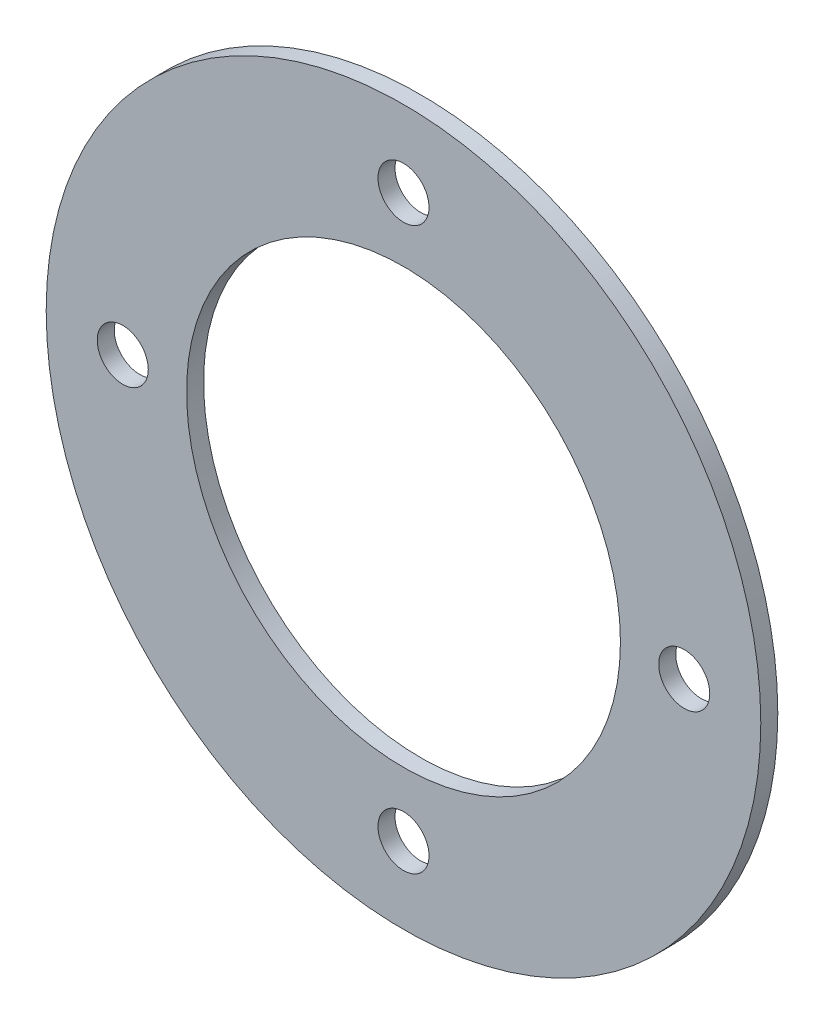
ISO-10303-21;
HEADER;
FILE_DESCRIPTION(('STEP AP214'),'2;1');
FILE_NAME('part.step','',(''),(''),'','','');
FILE_SCHEMA(('AUTOMOTIVE_DESIGN { 1 0 10303 214 1 1 1 1 }'));
ENDSEC;
DATA;
#1=APPLICATION_CONTEXT('core data for automotive mechanical design processes');
#2=APPLICATION_PROTOCOL_DEFINITION('international standard','automotive_design',2000,#1);
#3=PRODUCT_CONTEXT('',#1,'mechanical');
#4=PRODUCT('Part','Part','',(#3));
#5=PRODUCT_RELATED_PRODUCT_CATEGORY('part','',(#4));
#6=PRODUCT_DEFINITION_FORMATION('','',#4);
#7=PRODUCT_DEFINITION_CONTEXT('part definition',#1,'design');
#8=PRODUCT_DEFINITION('design','',#6,#7);
#9=PRODUCT_DEFINITION_SHAPE('','',#8);
#10=(LENGTH_UNIT() NAMED_UNIT(*) SI_UNIT(.MILLI.,.METRE.));
#11=(NAMED_UNIT(*) PLANE_ANGLE_UNIT() SI_UNIT($,.RADIAN.));
#12=(NAMED_UNIT(*) SI_UNIT($,.STERADIAN.) SOLID_ANGLE_UNIT());
#13=UNCERTAINTY_MEASURE_WITH_UNIT(LENGTH_MEASURE(1.E-05),#10,'distance_accuracy_value','');
#14=(GEOMETRIC_REPRESENTATION_CONTEXT(3) GLOBAL_UNCERTAINTY_ASSIGNED_CONTEXT((#13)) GLOBAL_UNIT_ASSIGNED_CONTEXT((#10,
#11,#12)) REPRESENTATION_CONTEXT('',''));
#15=CARTESIAN_POINT('',(0.,0.,0.));
#16=DIRECTION('',(0.,0.,1.));
#17=DIRECTION('',(1.,0.,0.));
#18=AXIS2_PLACEMENT_3D('',#15,#16,#17);
#19=CARTESIAN_POINT('',(0.,0.,1.));
#20=DIRECTION('',(0.,0.,-1.));
#21=DIRECTION('',(-1.,0.,0.));
#22=AXIS2_PLACEMENT_3D('',#19,#20,#21);
#23=CYLINDRICAL_SURFACE('',#22,12.75);
#24=CARTESIAN_POINT('',(0.,0.,1.));
#25=DIRECTION('',(0.,0.,1.));
#26=DIRECTION('',(1.,0.,0.));
#27=AXIS2_PLACEMENT_3D('',#24,#25,#26);
#28=CIRCLE('',#27,12.75);
#29=CARTESIAN_POINT('',(12.75,0.,1.));
#30=VERTEX_POINT('',#29);
#31=EDGE_CURVE('E24',#30,#30,#28,.T.);
#32=ORIENTED_EDGE('',*,*,#31,.T.);
#33=EDGE_LOOP('',(#32));
#34=FACE_BOUND('',#33,.T.);
#35=CARTESIAN_POINT('',(0.,0.,0.));
#36=DIRECTION('',(0.,0.,1.));
#37=DIRECTION('',(1.,0.,0.));
#38=AXIS2_PLACEMENT_3D('',#35,#36,#37);
#39=CIRCLE('',#38,12.75);
#40=CARTESIAN_POINT('',(12.75,0.,0.));
#41=VERTEX_POINT('',#40);
#42=EDGE_CURVE('E53',#41,#41,#39,.T.);
#43=ORIENTED_EDGE('',*,*,#42,.F.);
#44=EDGE_LOOP('',(#43));
#45=FACE_BOUND('',#44,.T.);
#46=ADVANCED_FACE('F15',(#34,#45),#23,.F.);
#47=CARTESIAN_POINT('',(0.,-16.5,1.));
#48=DIRECTION('',(0.,0.,-1.));
#49=DIRECTION('',(-1.,0.,0.));
#50=AXIS2_PLACEMENT_3D('',#47,#48,#49);
#51=CYLINDRICAL_SURFACE('',#50,1.5);
#52=CARTESIAN_POINT('',(0.,-16.5,1.));
#53=DIRECTION('',(0.,0.,1.));
#54=DIRECTION('',(1.,0.,0.));
#55=AXIS2_PLACEMENT_3D('',#52,#53,#54);
#56=CIRCLE('',#55,1.5);
#57=CARTESIAN_POINT('',(1.5,-16.5,1.));
#58=VERTEX_POINT('',#57);
#59=EDGE_CURVE('E34',#58,#58,#56,.T.);
#60=ORIENTED_EDGE('',*,*,#59,.T.);
#61=EDGE_LOOP('',(#60));
#62=FACE_BOUND('',#61,.T.);
#63=CARTESIAN_POINT('',(0.,-16.5,0.));
#64=DIRECTION('',(0.,0.,1.));
#65=DIRECTION('',(1.,0.,0.));
#66=AXIS2_PLACEMENT_3D('',#63,#64,#65);
#67=CIRCLE('',#66,1.5);
#68=CARTESIAN_POINT('',(1.5,-16.5,0.));
#69=VERTEX_POINT('',#68);
#70=EDGE_CURVE('E50',#69,#69,#67,.T.);
#71=ORIENTED_EDGE('',*,*,#70,.F.);
#72=EDGE_LOOP('',(#71));
#73=FACE_BOUND('',#72,.T.);
#74=ADVANCED_FACE('F82',(#62,#73),#51,.F.);
#75=CARTESIAN_POINT('',(0.,16.5,1.));
#76=DIRECTION('',(0.,0.,-1.));
#77=DIRECTION('',(-1.,0.,0.));
#78=AXIS2_PLACEMENT_3D('',#75,#76,#77);
#79=CYLINDRICAL_SURFACE('',#78,1.5);
#80=CARTESIAN_POINT('',(0.,16.5,1.));
#81=DIRECTION('',(0.,0.,1.));
#82=DIRECTION('',(1.,0.,0.));
#83=AXIS2_PLACEMENT_3D('',#80,#81,#82);
#84=CIRCLE('',#83,1.5);
#85=CARTESIAN_POINT('',(1.5,16.5,1.));
#86=VERTEX_POINT('',#85);
#87=EDGE_CURVE('E73',#86,#86,#84,.T.);
#88=ORIENTED_EDGE('',*,*,#87,.T.);
#89=EDGE_LOOP('',(#88));
#90=FACE_BOUND('',#89,.T.);
#91=CARTESIAN_POINT('',(0.,16.5,0.));
#92=DIRECTION('',(0.,0.,1.));
#93=DIRECTION('',(1.,0.,0.));
#94=AXIS2_PLACEMENT_3D('',#91,#92,#93);
#95=CIRCLE('',#94,1.5);
#96=CARTESIAN_POINT('',(1.5,16.5,0.));
#97=VERTEX_POINT('',#96);
#98=EDGE_CURVE('E46',#97,#97,#95,.T.);
#99=ORIENTED_EDGE('',*,*,#98,.F.);
#100=EDGE_LOOP('',(#99));
#101=FACE_BOUND('',#100,.T.);
#102=ADVANCED_FACE('F102',(#90,#101),#79,.F.);
#103=CARTESIAN_POINT('',(16.5,0.,1.));
#104=DIRECTION('',(0.,0.,-1.));
#105=DIRECTION('',(-1.,0.,0.));
#106=AXIS2_PLACEMENT_3D('',#103,#104,#105);
#107=CYLINDRICAL_SURFACE('',#106,1.5);
#108=CARTESIAN_POINT('',(16.5,0.,1.));
#109=DIRECTION('',(0.,0.,1.));
#110=DIRECTION('',(1.,0.,0.));
#111=AXIS2_PLACEMENT_3D('',#108,#109,#110);
#112=CIRCLE('',#111,1.5);
#113=CARTESIAN_POINT('',(18.,0.,1.));
#114=VERTEX_POINT('',#113);
#115=EDGE_CURVE('E66',#114,#114,#112,.T.);
#116=ORIENTED_EDGE('',*,*,#115,.T.);
#117=EDGE_LOOP('',(#116));
#118=FACE_BOUND('',#117,.T.);
#119=CARTESIAN_POINT('',(16.5,0.,0.));
#120=DIRECTION('',(0.,0.,1.));
#121=DIRECTION('',(1.,0.,0.));
#122=AXIS2_PLACEMENT_3D('',#119,#120,#121);
#123=CIRCLE('',#122,1.5);
#124=CARTESIAN_POINT('',(18.,0.,0.));
#125=VERTEX_POINT('',#124);
#126=EDGE_CURVE('E42',#125,#125,#123,.T.);
#127=ORIENTED_EDGE('',*,*,#126,.F.);
#128=EDGE_LOOP('',(#127));
#129=FACE_BOUND('',#128,.T.);
#130=ADVANCED_FACE('F108',(#118,#129),#107,.F.);
#131=CARTESIAN_POINT('',(0.,0.,1.));
#132=DIRECTION('',(0.,0.,-1.));
#133=DIRECTION('',(-1.,0.,0.));
#134=AXIS2_PLACEMENT_3D('',#131,#132,#133);
#135=CYLINDRICAL_SURFACE('',#134,21.);
#136=CARTESIAN_POINT('',(0.,0.,1.));
#137=DIRECTION('',(0.,0.,-1.));
#138=DIRECTION('',(1.,0.,0.));
#139=AXIS2_PLACEMENT_3D('',#136,#137,#138);
#140=CIRCLE('',#139,21.);
#141=CARTESIAN_POINT('',(21.,0.,1.));
#142=VERTEX_POINT('',#141);
#143=EDGE_CURVE('E61',#142,#142,#140,.T.);
#144=ORIENTED_EDGE('',*,*,#143,.T.);
#145=EDGE_LOOP('',(#144));
#146=FACE_BOUND('',#145,.T.);
#147=CARTESIAN_POINT('',(0.,0.,0.));
#148=DIRECTION('',(0.,0.,-1.));
#149=DIRECTION('',(1.,0.,0.));
#150=AXIS2_PLACEMENT_3D('',#147,#148,#149);
#151=CIRCLE('',#150,21.);
#152=CARTESIAN_POINT('',(21.,0.,0.));
#153=VERTEX_POINT('',#152);
#154=EDGE_CURVE('E38',#153,#153,#151,.T.);
#155=ORIENTED_EDGE('',*,*,#154,.F.);
#156=EDGE_LOOP('',(#155));
#157=FACE_BOUND('',#156,.T.);
#158=ADVANCED_FACE('F17',(#146,#157),#135,.T.);
#159=CARTESIAN_POINT('',(-16.5,0.,1.));
#160=DIRECTION('',(0.,0.,-1.));
#161=DIRECTION('',(-1.,0.,0.));
#162=AXIS2_PLACEMENT_3D('',#159,#160,#161);
#163=CYLINDRICAL_SURFACE('',#162,1.5);
#164=CARTESIAN_POINT('',(-16.5,0.,1.));
#165=DIRECTION('',(0.,0.,1.));
#166=DIRECTION('',(1.,0.,0.));
#167=AXIS2_PLACEMENT_3D('',#164,#165,#166);
#168=CIRCLE('',#167,1.5);
#169=CARTESIAN_POINT('',(-15.,0.,1.));
#170=VERTEX_POINT('',#169);
#171=EDGE_CURVE('E10',#170,#170,#168,.T.);
#172=ORIENTED_EDGE('',*,*,#171,.T.);
#173=EDGE_LOOP('',(#172));
#174=FACE_BOUND('',#173,.T.);
#175=CARTESIAN_POINT('',(-16.5,0.,0.));
#176=DIRECTION('',(0.,0.,1.));
#177=DIRECTION('',(1.,0.,0.));
#178=AXIS2_PLACEMENT_3D('',#175,#176,#177);
#179=CIRCLE('',#178,1.5);
#180=CARTESIAN_POINT('',(-15.,0.,0.));
#181=VERTEX_POINT('',#180);
#182=EDGE_CURVE('E19',#181,#181,#179,.T.);
#183=ORIENTED_EDGE('',*,*,#182,.F.);
#184=EDGE_LOOP('',(#183));
#185=FACE_BOUND('',#184,.T.);
#186=ADVANCED_FACE('F89',(#174,#185),#163,.F.);
#187=CARTESIAN_POINT('',(8.25,0.,1.));
#188=DIRECTION('',(0.,0.,-1.));
#189=DIRECTION('',(-1.,0.,0.));
#190=AXIS2_PLACEMENT_3D('',#187,#188,#189);
#191=PLANE('',#190);
#192=ORIENTED_EDGE('',*,*,#143,.F.);
#193=EDGE_LOOP('',(#192));
#194=FACE_BOUND('',#193,.T.);
#195=ORIENTED_EDGE('',*,*,#115,.F.);
#196=EDGE_LOOP('',(#195));
#197=FACE_BOUND('',#196,.T.);
#198=ORIENTED_EDGE('',*,*,#87,.F.);
#199=EDGE_LOOP('',(#198));
#200=FACE_BOUND('',#199,.T.);
#201=ORIENTED_EDGE('',*,*,#59,.F.);
#202=EDGE_LOOP('',(#201));
#203=FACE_BOUND('',#202,.T.);
#204=ORIENTED_EDGE('',*,*,#31,.F.);
#205=EDGE_LOOP('',(#204));
#206=FACE_BOUND('',#205,.T.);
#207=ORIENTED_EDGE('',*,*,#171,.F.);
#208=EDGE_LOOP('',(#207));
#209=FACE_BOUND('',#208,.T.);
#210=ADVANCED_FACE('F85',(#194,#197,#200,#203,#206,#209),#191,.F.);
#211=CARTESIAN_POINT('',(8.25,0.,0.));
#212=DIRECTION('',(0.,0.,-1.));
#213=DIRECTION('',(-1.,0.,0.));
#214=AXIS2_PLACEMENT_3D('',#211,#212,#213);
#215=PLANE('',#214);
#216=ORIENTED_EDGE('',*,*,#154,.T.);
#217=EDGE_LOOP('',(#216));
#218=FACE_BOUND('',#217,.T.);
#219=ORIENTED_EDGE('',*,*,#126,.T.);
#220=EDGE_LOOP('',(#219));
#221=FACE_BOUND('',#220,.T.);
#222=ORIENTED_EDGE('',*,*,#98,.T.);
#223=EDGE_LOOP('',(#222));
#224=FACE_BOUND('',#223,.T.);
#225=ORIENTED_EDGE('',*,*,#70,.T.);
#226=EDGE_LOOP('',(#225));
#227=FACE_BOUND('',#226,.T.);
#228=ORIENTED_EDGE('',*,*,#42,.T.);
#229=EDGE_LOOP('',(#228));
#230=FACE_BOUND('',#229,.T.);
#231=ORIENTED_EDGE('',*,*,#182,.T.);
#232=EDGE_LOOP('',(#231));
#233=FACE_BOUND('',#232,.T.);
#234=ADVANCED_FACE('F88',(#218,#221,#224,#227,#230,#233),#215,.T.);
#235=CLOSED_SHELL('',(#46,#74,#102,#130,#158,#186,#210,#234));
#236=MANIFOLD_SOLID_BREP('B1',#235);
#237=ADVANCED_BREP_SHAPE_REPRESENTATION('',(#18,#236),#14);
#238=SHAPE_DEFINITION_REPRESENTATION(#9,#237);
ENDSEC;
END-ISO-10303-21;
